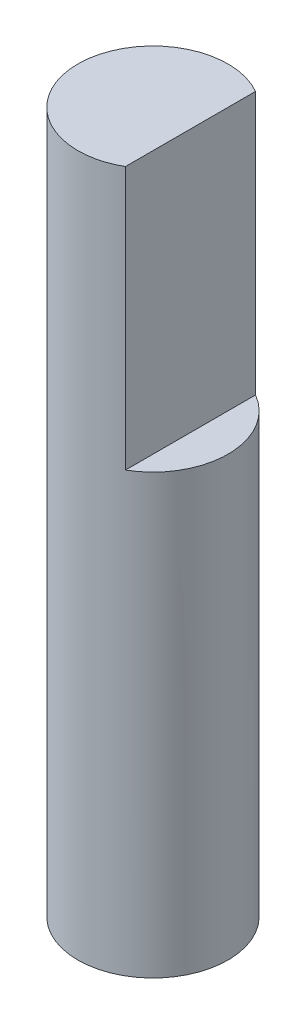
ISO-10303-21;
HEADER;
FILE_DESCRIPTION(('STEP AP214'),'2;1');
FILE_NAME('part.step','',(''),(''),'','','');
FILE_SCHEMA(('AUTOMOTIVE_DESIGN { 1 0 10303 214 1 1 1 1 }'));
ENDSEC;
DATA;
#1=APPLICATION_CONTEXT('core data for automotive mechanical design processes');
#2=APPLICATION_PROTOCOL_DEFINITION('international standard','automotive_design',2000,#1);
#3=PRODUCT_CONTEXT('',#1,'mechanical');
#4=PRODUCT('Part','Part','',(#3));
#5=PRODUCT_RELATED_PRODUCT_CATEGORY('part','',(#4));
#6=PRODUCT_DEFINITION_FORMATION('','',#4);
#7=PRODUCT_DEFINITION_CONTEXT('part definition',#1,'design');
#8=PRODUCT_DEFINITION('design','',#6,#7);
#9=PRODUCT_DEFINITION_SHAPE('','',#8);
#10=(LENGTH_UNIT() NAMED_UNIT(*) SI_UNIT(.MILLI.,.METRE.));
#11=(NAMED_UNIT(*) PLANE_ANGLE_UNIT() SI_UNIT($,.RADIAN.));
#12=(NAMED_UNIT(*) SI_UNIT($,.STERADIAN.) SOLID_ANGLE_UNIT());
#13=UNCERTAINTY_MEASURE_WITH_UNIT(LENGTH_MEASURE(1.E-05),#10,'distance_accuracy_value','');
#14=(GEOMETRIC_REPRESENTATION_CONTEXT(3) GLOBAL_UNCERTAINTY_ASSIGNED_CONTEXT((#13)) GLOBAL_UNIT_ASSIGNED_CONTEXT((#10,
#11,#12)) REPRESENTATION_CONTEXT('',''));
#15=CARTESIAN_POINT('',(0.,0.,0.));
#16=DIRECTION('',(0.,0.,1.));
#17=DIRECTION('',(1.,0.,0.));
#18=AXIS2_PLACEMENT_3D('',#15,#16,#17);
#19=CARTESIAN_POINT('',(0.,-10.,0.));
#20=DIRECTION('',(0.,1.,0.));
#21=DIRECTION('',(0.,0.,1.));
#22=AXIS2_PLACEMENT_3D('',#19,#20,#21);
#23=CYLINDRICAL_SURFACE('',#22,3.);
#24=DIRECTION('',(0.,1.,0.));
#25=VECTOR('',#24,1.);
#26=CARTESIAN_POINT('',(1.5,-10.,2.59807621135332));
#27=LINE('',#26,#25);
#28=CARTESIAN_POINT('',(1.5,18.,2.59807621135332));
#29=VERTEX_POINT('',#28);
#30=CARTESIAN_POINT('',(1.5,7.5,2.59807621135332));
#31=VERTEX_POINT('',#30);
#32=EDGE_CURVE('E51',#29,#31,#27,.F.);
#33=ORIENTED_EDGE('',*,*,#32,.F.);
#34=CARTESIAN_POINT('',(0.,18.,0.));
#35=DIRECTION('',(0.,1.,0.));
#36=DIRECTION('',(0.,0.,1.));
#37=AXIS2_PLACEMENT_3D('',#34,#35,#36);
#38=CIRCLE('',#37,3.);
#39=CARTESIAN_POINT('',(1.5,18.,-2.59807621135332));
#40=VERTEX_POINT('',#39);
#41=EDGE_CURVE('E64',#40,#29,#38,.T.);
#42=ORIENTED_EDGE('',*,*,#41,.F.);
#43=DIRECTION('',(0.,1.,0.));
#44=VECTOR('',#43,1.);
#45=CARTESIAN_POINT('',(1.5,-10.,-2.59807621135332));
#46=LINE('',#45,#44);
#47=CARTESIAN_POINT('',(1.5,7.5,-2.59807621135332));
#48=VERTEX_POINT('',#47);
#49=EDGE_CURVE('E46',#48,#40,#46,.T.);
#50=ORIENTED_EDGE('',*,*,#49,.F.);
#51=CARTESIAN_POINT('',(0.,7.5,0.));
#52=DIRECTION('',(0.,1.,0.));
#53=DIRECTION('',(0.,0.,1.));
#54=AXIS2_PLACEMENT_3D('',#51,#52,#53);
#55=CIRCLE('',#54,3.);
#56=EDGE_CURVE('E11',#48,#31,#55,.F.);
#57=ORIENTED_EDGE('',*,*,#56,.T.);
#58=EDGE_LOOP('',(#33,#42,#50,#57));
#59=FACE_BOUND('',#58,.T.);
#60=CARTESIAN_POINT('',(0.,-10.,0.));
#61=DIRECTION('',(0.,1.,0.));
#62=DIRECTION('',(0.,0.,1.));
#63=AXIS2_PLACEMENT_3D('',#60,#61,#62);
#64=CIRCLE('',#63,3.);
#65=CARTESIAN_POINT('',(0.,-10.,3.));
#66=VERTEX_POINT('',#65);
#67=EDGE_CURVE('E61',#66,#66,#64,.T.);
#68=ORIENTED_EDGE('',*,*,#67,.T.);
#69=EDGE_LOOP('',(#68));
#70=FACE_BOUND('',#69,.T.);
#71=ADVANCED_FACE('F32',(#59,#70),#23,.T.);
#72=CARTESIAN_POINT('',(0.,-10.,0.));
#73=DIRECTION('',(0.,1.,0.));
#74=DIRECTION('',(0.,0.,1.));
#75=AXIS2_PLACEMENT_3D('',#72,#73,#74);
#76=PLANE('',#75);
#77=ORIENTED_EDGE('',*,*,#67,.F.);
#78=EDGE_LOOP('',(#77));
#79=FACE_BOUND('',#78,.T.);
#80=ADVANCED_FACE('F82',(#79),#76,.F.);
#81=CARTESIAN_POINT('',(0.,18.,0.));
#82=DIRECTION('',(0.,1.,0.));
#83=DIRECTION('',(0.,0.,1.));
#84=AXIS2_PLACEMENT_3D('',#81,#82,#83);
#85=PLANE('',#84);
#86=DIRECTION('',(0.,0.,1.));
#87=VECTOR('',#86,1.);
#88=CARTESIAN_POINT('',(1.5,18.,0.));
#89=LINE('',#88,#87);
#90=EDGE_CURVE('E39',#40,#29,#89,.T.);
#91=ORIENTED_EDGE('',*,*,#90,.F.);
#92=ORIENTED_EDGE('',*,*,#41,.T.);
#93=EDGE_LOOP('',(#91,#92));
#94=FACE_BOUND('',#93,.T.);
#95=ADVANCED_FACE('F66',(#94),#85,.T.);
#96=CARTESIAN_POINT('',(1.5,7.5,-3.));
#97=DIRECTION('',(-1.,0.,0.));
#98=DIRECTION('',(0.,0.,1.));
#99=AXIS2_PLACEMENT_3D('',#96,#97,#98);
#100=PLANE('',#99);
#101=ORIENTED_EDGE('',*,*,#32,.T.);
#102=DIRECTION('',(0.,0.,1.));
#103=VECTOR('',#102,1.);
#104=CARTESIAN_POINT('',(1.5,7.5,-3.));
#105=LINE('',#104,#103);
#106=EDGE_CURVE('E72',#48,#31,#105,.T.);
#107=ORIENTED_EDGE('',*,*,#106,.F.);
#108=ORIENTED_EDGE('',*,*,#49,.T.);
#109=ORIENTED_EDGE('',*,*,#90,.T.);
#110=EDGE_LOOP('',(#101,#107,#108,#109));
#111=FACE_BOUND('',#110,.T.);
#112=ADVANCED_FACE('F57',(#111),#100,.F.);
#113=CARTESIAN_POINT('',(0.,7.5,0.));
#114=DIRECTION('',(0.,1.,0.));
#115=DIRECTION('',(0.,0.,1.));
#116=AXIS2_PLACEMENT_3D('',#113,#114,#115);
#117=PLANE('',#116);
#118=ORIENTED_EDGE('',*,*,#106,.T.);
#119=ORIENTED_EDGE('',*,*,#56,.F.);
#120=EDGE_LOOP('',(#118,#119));
#121=FACE_BOUND('',#120,.T.);
#122=ADVANCED_FACE('F74',(#121),#117,.T.);
#123=CLOSED_SHELL('',(#71,#80,#95,#112,#122));
#124=MANIFOLD_SOLID_BREP('B2',#123);
#125=ADVANCED_BREP_SHAPE_REPRESENTATION('',(#18,#124),#14);
#126=SHAPE_DEFINITION_REPRESENTATION(#9,#125);
ENDSEC;
END-ISO-10303-21;
